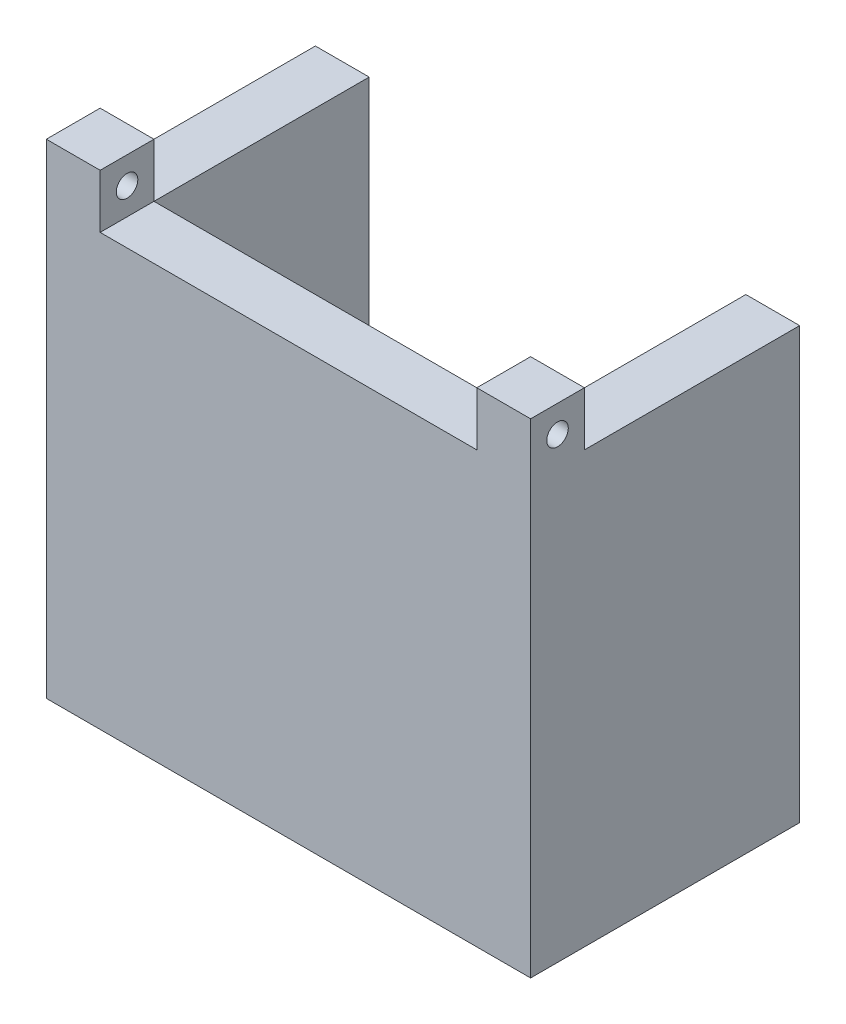
ISO-10303-21;
HEADER;
FILE_DESCRIPTION(('STEP AP214'),'2;1');
FILE_NAME('part.step','',(''),(''),'','','');
FILE_SCHEMA(('AUTOMOTIVE_DESIGN { 1 0 10303 214 1 1 1 1 }'));
ENDSEC;
DATA;
#1=APPLICATION_CONTEXT('core data for automotive mechanical design processes');
#2=APPLICATION_PROTOCOL_DEFINITION('international standard','automotive_design',2000,#1);
#3=PRODUCT_CONTEXT('',#1,'mechanical');
#4=PRODUCT('Part','Part','',(#3));
#5=PRODUCT_RELATED_PRODUCT_CATEGORY('part','',(#4));
#6=PRODUCT_DEFINITION_FORMATION('','',#4);
#7=PRODUCT_DEFINITION_CONTEXT('part definition',#1,'design');
#8=PRODUCT_DEFINITION('design','',#6,#7);
#9=PRODUCT_DEFINITION_SHAPE('','',#8);
#10=(LENGTH_UNIT() NAMED_UNIT(*) SI_UNIT(.MILLI.,.METRE.));
#11=(NAMED_UNIT(*) PLANE_ANGLE_UNIT() SI_UNIT($,.RADIAN.));
#12=(NAMED_UNIT(*) SI_UNIT($,.STERADIAN.) SOLID_ANGLE_UNIT());
#13=UNCERTAINTY_MEASURE_WITH_UNIT(LENGTH_MEASURE(1.E-05),#10,'distance_accuracy_value','');
#14=(GEOMETRIC_REPRESENTATION_CONTEXT(3) GLOBAL_UNCERTAINTY_ASSIGNED_CONTEXT((#13)) GLOBAL_UNIT_ASSIGNED_CONTEXT((#10,
#11,#12)) REPRESENTATION_CONTEXT('',''));
#15=CARTESIAN_POINT('',(0.,0.,0.));
#16=DIRECTION('',(0.,0.,1.));
#17=DIRECTION('',(1.,0.,0.));
#18=AXIS2_PLACEMENT_3D('',#15,#16,#17);
#19=CARTESIAN_POINT('',(0.,0.,0.));
#20=DIRECTION('',(0.,0.,1.));
#21=DIRECTION('',(1.,0.,0.));
#22=AXIS2_PLACEMENT_3D('',#19,#20,#21);
#23=PLANE('',#22);
#24=DIRECTION('',(0.,1.,0.));
#25=VECTOR('',#24,1.);
#26=CARTESIAN_POINT('',(-17.5,22.5,0.));
#27=LINE('',#26,#25);
#28=CARTESIAN_POINT('',(-17.5,17.5,0.));
#29=VERTEX_POINT('',#28);
#30=CARTESIAN_POINT('',(-17.5,22.5,0.));
#31=VERTEX_POINT('',#30);
#32=EDGE_CURVE('E237',#29,#31,#27,.T.);
#33=ORIENTED_EDGE('',*,*,#32,.F.);
#34=DIRECTION('',(-1.,0.,0.));
#35=VECTOR('',#34,1.);
#36=CARTESIAN_POINT('',(-22.5,17.5,0.));
#37=LINE('',#36,#35);
#38=CARTESIAN_POINT('',(-22.5,17.5,0.));
#39=VERTEX_POINT('',#38);
#40=EDGE_CURVE('E163',#29,#39,#37,.T.);
#41=ORIENTED_EDGE('',*,*,#40,.T.);
#42=DIRECTION('',(0.,-1.,0.));
#43=VECTOR('',#42,1.);
#44=CARTESIAN_POINT('',(-22.5,22.5,0.));
#45=LINE('',#44,#43);
#46=CARTESIAN_POINT('',(-22.5,22.5,0.));
#47=VERTEX_POINT('',#46);
#48=EDGE_CURVE('E139',#47,#39,#45,.T.);
#49=ORIENTED_EDGE('',*,*,#48,.F.);
#50=DIRECTION('',(-1.,0.,0.));
#51=VECTOR('',#50,1.);
#52=CARTESIAN_POINT('',(-22.5,22.5,0.));
#53=LINE('',#52,#51);
#54=EDGE_CURVE('E213',#31,#47,#53,.T.);
#55=ORIENTED_EDGE('',*,*,#54,.F.);
#56=EDGE_LOOP('',(#33,#41,#49,#55));
#57=FACE_BOUND('',#56,.T.);
#58=ADVANCED_FACE('F33',(#57),#23,.F.);
#59=DIRECTION('',(1.,0.,0.));
#60=VECTOR('',#59,1.);
#61=CARTESIAN_POINT('',(22.5,17.5,0.));
#62=LINE('',#61,#60);
#63=CARTESIAN_POINT('',(17.5,17.5,0.));
#64=VERTEX_POINT('',#63);
#65=CARTESIAN_POINT('',(22.5,17.5,0.));
#66=VERTEX_POINT('',#65);
#67=EDGE_CURVE('E172',#64,#66,#62,.T.);
#68=ORIENTED_EDGE('',*,*,#67,.F.);
#69=DIRECTION('',(0.,-1.,0.));
#70=VECTOR('',#69,1.);
#71=CARTESIAN_POINT('',(17.5,22.5,0.));
#72=LINE('',#71,#70);
#73=CARTESIAN_POINT('',(17.5,22.5,0.));
#74=VERTEX_POINT('',#73);
#75=EDGE_CURVE('E259',#74,#64,#72,.T.);
#76=ORIENTED_EDGE('',*,*,#75,.F.);
#77=CARTESIAN_POINT('',(22.5,22.5,0.));
#78=VERTEX_POINT('',#77);
#79=EDGE_CURVE('E221',#78,#74,#53,.T.);
#80=ORIENTED_EDGE('',*,*,#79,.F.);
#81=DIRECTION('',(0.,1.,0.));
#82=VECTOR('',#81,1.);
#83=CARTESIAN_POINT('',(22.5,22.5,0.));
#84=LINE('',#83,#82);
#85=EDGE_CURVE('E211',#66,#78,#84,.T.);
#86=ORIENTED_EDGE('',*,*,#85,.F.);
#87=EDGE_LOOP('',(#68,#76,#80,#86));
#88=FACE_BOUND('',#87,.T.);
#89=ADVANCED_FACE('F310',(#88),#23,.F.);
#90=DIRECTION('',(1.,0.,0.));
#91=VECTOR('',#90,1.);
#92=CARTESIAN_POINT('',(-22.5,-22.5,0.));
#93=LINE('',#92,#91);
#94=CARTESIAN_POINT('',(-17.5,-22.5,0.));
#95=VERTEX_POINT('',#94);
#96=CARTESIAN_POINT('',(17.5,-22.5,0.));
#97=VERTEX_POINT('',#96);
#98=EDGE_CURVE('E37',#95,#97,#93,.T.);
#99=ORIENTED_EDGE('',*,*,#98,.F.);
#100=DIRECTION('',(0.,1.,0.));
#101=VECTOR('',#100,1.);
#102=CARTESIAN_POINT('',(-17.5,-22.5,0.));
#103=LINE('',#102,#101);
#104=EDGE_CURVE('E51',#95,#29,#103,.T.);
#105=ORIENTED_EDGE('',*,*,#104,.T.);
#106=DIRECTION('',(-1.,0.,0.));
#107=VECTOR('',#106,1.);
#108=CARTESIAN_POINT('',(17.5,17.5,0.));
#109=LINE('',#108,#107);
#110=EDGE_CURVE('E242',#64,#29,#109,.T.);
#111=ORIENTED_EDGE('',*,*,#110,.F.);
#112=DIRECTION('',(0.,1.,0.));
#113=VECTOR('',#112,1.);
#114=CARTESIAN_POINT('',(17.5,-22.5,0.));
#115=LINE('',#114,#113);
#116=EDGE_CURVE('E144',#97,#64,#115,.T.);
#117=ORIENTED_EDGE('',*,*,#116,.F.);
#118=EDGE_LOOP('',(#99,#105,#111,#117));
#119=FACE_BOUND('',#118,.T.);
#120=ADVANCED_FACE('F240',(#119),#23,.F.);
#121=CARTESIAN_POINT('',(-22.5,22.5,5.));
#122=DIRECTION('',(0.,-1.,0.));
#123=DIRECTION('',(0.,0.,-1.));
#124=AXIS2_PLACEMENT_3D('',#121,#122,#123);
#125=PLANE('',#124);
#126=ORIENTED_EDGE('',*,*,#79,.T.);
#127=DIRECTION('',(0.,0.,-1.));
#128=VECTOR('',#127,1.);
#129=CARTESIAN_POINT('',(17.5,22.5,5.));
#130=LINE('',#129,#128);
#131=CARTESIAN_POINT('',(17.5,22.5,5.));
#132=VERTEX_POINT('',#131);
#133=EDGE_CURVE('E266',#132,#74,#130,.T.);
#134=ORIENTED_EDGE('',*,*,#133,.F.);
#135=DIRECTION('',(-1.,0.,0.));
#136=VECTOR('',#135,1.);
#137=CARTESIAN_POINT('',(-22.5,22.5,5.));
#138=LINE('',#137,#136);
#139=CARTESIAN_POINT('',(22.5,22.5,5.));
#140=VERTEX_POINT('',#139);
#141=EDGE_CURVE('E279',#140,#132,#138,.T.);
#142=ORIENTED_EDGE('',*,*,#141,.F.);
#143=DIRECTION('',(0.,0.,-1.));
#144=VECTOR('',#143,1.);
#145=CARTESIAN_POINT('',(22.5,22.5,5.));
#146=LINE('',#145,#144);
#147=EDGE_CURVE('E11',#140,#78,#146,.T.);
#148=ORIENTED_EDGE('',*,*,#147,.T.);
#149=EDGE_LOOP('',(#126,#134,#142,#148));
#150=FACE_BOUND('',#149,.T.);
#151=ADVANCED_FACE('F292',(#150),#125,.F.);
#152=CARTESIAN_POINT('',(22.5,22.5,5.));
#153=DIRECTION('',(-1.,0.,0.));
#154=DIRECTION('',(0.,-1.,0.));
#155=AXIS2_PLACEMENT_3D('',#152,#153,#154);
#156=PLANE('',#155);
#157=CARTESIAN_POINT('',(22.5,20.,2.5));
#158=DIRECTION('',(1.,0.,0.));
#159=DIRECTION('',(0.,1.,0.));
#160=AXIS2_PLACEMENT_3D('',#157,#158,#159);
#161=CIRCLE('',#160,1.);
#162=CARTESIAN_POINT('',(22.5,21.,2.5));
#163=VERTEX_POINT('',#162);
#164=EDGE_CURVE('E214',#163,#163,#161,.T.);
#165=ORIENTED_EDGE('',*,*,#164,.F.);
#166=EDGE_LOOP('',(#165));
#167=FACE_BOUND('',#166,.T.);
#168=DIRECTION('',(0.,0.,-1.));
#169=VECTOR('',#168,1.);
#170=CARTESIAN_POINT('',(22.5,-22.5,5.));
#171=LINE('',#170,#169);
#172=CARTESIAN_POINT('',(22.5,-22.5,5.));
#173=VERTEX_POINT('',#172);
#174=CARTESIAN_POINT('',(22.5,-22.5,-20.));
#175=VERTEX_POINT('',#174);
#176=EDGE_CURVE('E226',#173,#175,#171,.T.);
#177=ORIENTED_EDGE('',*,*,#176,.T.);
#178=DIRECTION('',(0.,-1.,0.));
#179=VECTOR('',#178,1.);
#180=CARTESIAN_POINT('',(22.5,-22.5,-20.));
#181=LINE('',#180,#179);
#182=CARTESIAN_POINT('',(22.5,17.5,-20.));
#183=VERTEX_POINT('',#182);
#184=EDGE_CURVE('E168',#183,#175,#181,.T.);
#185=ORIENTED_EDGE('',*,*,#184,.F.);
#186=DIRECTION('',(0.,0.,1.));
#187=VECTOR('',#186,1.);
#188=CARTESIAN_POINT('',(22.5,17.5,-20.));
#189=LINE('',#188,#187);
#190=EDGE_CURVE('E178',#183,#66,#189,.T.);
#191=ORIENTED_EDGE('',*,*,#190,.T.);
#192=ORIENTED_EDGE('',*,*,#85,.T.);
#193=ORIENTED_EDGE('',*,*,#147,.F.);
#194=DIRECTION('',(0.,1.,0.));
#195=VECTOR('',#194,1.);
#196=CARTESIAN_POINT('',(22.5,22.5,5.));
#197=LINE('',#196,#195);
#198=EDGE_CURVE('E275',#173,#140,#197,.T.);
#199=ORIENTED_EDGE('',*,*,#198,.F.);
#200=EDGE_LOOP('',(#177,#185,#191,#192,#193,#199));
#201=FACE_BOUND('',#200,.T.);
#202=ADVANCED_FACE('F35',(#167,#201),#156,.F.);
#203=CARTESIAN_POINT('',(-17.5,22.5,5.));
#204=VERTEX_POINT('',#203);
#205=CARTESIAN_POINT('',(-22.5,22.5,5.));
#206=VERTEX_POINT('',#205);
#207=EDGE_CURVE('E278',#204,#206,#138,.T.);
#208=ORIENTED_EDGE('',*,*,#207,.F.);
#209=DIRECTION('',(0.,0.,-1.));
#210=VECTOR('',#209,1.);
#211=CARTESIAN_POINT('',(-17.5,22.5,5.));
#212=LINE('',#211,#210);
#213=EDGE_CURVE('E254',#204,#31,#212,.T.);
#214=ORIENTED_EDGE('',*,*,#213,.T.);
#215=ORIENTED_EDGE('',*,*,#54,.T.);
#216=DIRECTION('',(0.,0.,-1.));
#217=VECTOR('',#216,1.);
#218=CARTESIAN_POINT('',(-22.5,22.5,5.));
#219=LINE('',#218,#217);
#220=EDGE_CURVE('E43',#206,#47,#219,.T.);
#221=ORIENTED_EDGE('',*,*,#220,.F.);
#222=EDGE_LOOP('',(#208,#214,#215,#221));
#223=FACE_BOUND('',#222,.T.);
#224=ADVANCED_FACE('F298',(#223),#125,.F.);
#225=CARTESIAN_POINT('',(-22.5,22.5,5.));
#226=DIRECTION('',(1.,0.,0.));
#227=DIRECTION('',(0.,1.,0.));
#228=AXIS2_PLACEMENT_3D('',#225,#226,#227);
#229=PLANE('',#228);
#230=CARTESIAN_POINT('',(-22.5,20.,2.5));
#231=DIRECTION('',(1.,0.,0.));
#232=DIRECTION('',(0.,1.,0.));
#233=AXIS2_PLACEMENT_3D('',#230,#231,#232);
#234=CIRCLE('',#233,1.);
#235=CARTESIAN_POINT('',(-22.5,21.,2.5));
#236=VERTEX_POINT('',#235);
#237=EDGE_CURVE('E200',#236,#236,#234,.T.);
#238=ORIENTED_EDGE('',*,*,#237,.T.);
#239=EDGE_LOOP('',(#238));
#240=FACE_BOUND('',#239,.T.);
#241=ORIENTED_EDGE('',*,*,#48,.T.);
#242=DIRECTION('',(0.,0.,1.));
#243=VECTOR('',#242,1.);
#244=CARTESIAN_POINT('',(-22.5,17.5,-20.));
#245=LINE('',#244,#243);
#246=CARTESIAN_POINT('',(-22.5,17.5,-20.));
#247=VERTEX_POINT('',#246);
#248=EDGE_CURVE('E131',#247,#39,#245,.T.);
#249=ORIENTED_EDGE('',*,*,#248,.F.);
#250=DIRECTION('',(0.,-1.,0.));
#251=VECTOR('',#250,1.);
#252=CARTESIAN_POINT('',(-22.5,-22.5,-20.));
#253=LINE('',#252,#251);
#254=CARTESIAN_POINT('',(-22.5,-22.5,-20.));
#255=VERTEX_POINT('',#254);
#256=EDGE_CURVE('E135',#247,#255,#253,.T.);
#257=ORIENTED_EDGE('',*,*,#256,.T.);
#258=DIRECTION('',(0.,0.,-1.));
#259=VECTOR('',#258,1.);
#260=CARTESIAN_POINT('',(-22.5,-22.5,5.));
#261=LINE('',#260,#259);
#262=CARTESIAN_POINT('',(-22.5,-22.5,5.));
#263=VERTEX_POINT('',#262);
#264=EDGE_CURVE('E228',#263,#255,#261,.T.);
#265=ORIENTED_EDGE('',*,*,#264,.F.);
#266=DIRECTION('',(0.,-1.,0.));
#267=VECTOR('',#266,1.);
#268=CARTESIAN_POINT('',(-22.5,22.5,5.));
#269=LINE('',#268,#267);
#270=EDGE_CURVE('E231',#206,#263,#269,.T.);
#271=ORIENTED_EDGE('',*,*,#270,.F.);
#272=ORIENTED_EDGE('',*,*,#220,.T.);
#273=EDGE_LOOP('',(#241,#249,#257,#265,#271,#272));
#274=FACE_BOUND('',#273,.T.);
#275=ADVANCED_FACE('F133',(#240,#274),#229,.F.);
#276=CARTESIAN_POINT('',(-22.5,-22.5,5.));
#277=DIRECTION('',(0.,1.,0.));
#278=DIRECTION('',(0.,0.,1.));
#279=AXIS2_PLACEMENT_3D('',#276,#277,#278);
#280=PLANE('',#279);
#281=ORIENTED_EDGE('',*,*,#264,.T.);
#282=DIRECTION('',(1.,0.,0.));
#283=VECTOR('',#282,1.);
#284=CARTESIAN_POINT('',(-22.5,-22.5,-20.));
#285=LINE('',#284,#283);
#286=CARTESIAN_POINT('',(-17.5,-22.5,-20.));
#287=VERTEX_POINT('',#286);
#288=EDGE_CURVE('E154',#255,#287,#285,.T.);
#289=ORIENTED_EDGE('',*,*,#288,.T.);
#290=DIRECTION('',(0.,0.,1.));
#291=VECTOR('',#290,1.);
#292=CARTESIAN_POINT('',(-17.5,-22.5,-20.));
#293=LINE('',#292,#291);
#294=EDGE_CURVE('E162',#287,#95,#293,.T.);
#295=ORIENTED_EDGE('',*,*,#294,.T.);
#296=ORIENTED_EDGE('',*,*,#98,.T.);
#297=DIRECTION('',(0.,0.,1.));
#298=VECTOR('',#297,1.);
#299=CARTESIAN_POINT('',(17.5,-22.5,-20.));
#300=LINE('',#299,#298);
#301=CARTESIAN_POINT('',(17.5,-22.5,-20.));
#302=VERTEX_POINT('',#301);
#303=EDGE_CURVE('E195',#302,#97,#300,.T.);
#304=ORIENTED_EDGE('',*,*,#303,.F.);
#305=DIRECTION('',(-1.,0.,0.));
#306=VECTOR('',#305,1.);
#307=CARTESIAN_POINT('',(22.5,-22.5,-20.));
#308=LINE('',#307,#306);
#309=EDGE_CURVE('E171',#175,#302,#308,.T.);
#310=ORIENTED_EDGE('',*,*,#309,.F.);
#311=ORIENTED_EDGE('',*,*,#176,.F.);
#312=DIRECTION('',(1.,0.,0.));
#313=VECTOR('',#312,1.);
#314=CARTESIAN_POINT('',(-22.5,-22.5,5.));
#315=LINE('',#314,#313);
#316=EDGE_CURVE('E219',#263,#173,#315,.T.);
#317=ORIENTED_EDGE('',*,*,#316,.F.);
#318=EDGE_LOOP('',(#281,#289,#295,#296,#304,#310,#311,#317));
#319=FACE_BOUND('',#318,.T.);
#320=ADVANCED_FACE('F289',(#319),#280,.F.);
#321=CARTESIAN_POINT('',(0.,0.,5.));
#322=DIRECTION('',(0.,0.,1.));
#323=DIRECTION('',(1.,0.,0.));
#324=AXIS2_PLACEMENT_3D('',#321,#322,#323);
#325=PLANE('',#324);
#326=DIRECTION('',(0.,-1.,0.));
#327=VECTOR('',#326,1.);
#328=CARTESIAN_POINT('',(17.5,22.5,5.));
#329=LINE('',#328,#327);
#330=CARTESIAN_POINT('',(17.5,17.5,5.));
#331=VERTEX_POINT('',#330);
#332=EDGE_CURVE('E261',#132,#331,#329,.T.);
#333=ORIENTED_EDGE('',*,*,#332,.T.);
#334=DIRECTION('',(-1.,0.,0.));
#335=VECTOR('',#334,1.);
#336=CARTESIAN_POINT('',(17.5,17.5,5.));
#337=LINE('',#336,#335);
#338=CARTESIAN_POINT('',(-17.5,17.5,5.));
#339=VERTEX_POINT('',#338);
#340=EDGE_CURVE('E294',#331,#339,#337,.T.);
#341=ORIENTED_EDGE('',*,*,#340,.T.);
#342=DIRECTION('',(0.,1.,0.));
#343=VECTOR('',#342,1.);
#344=CARTESIAN_POINT('',(-17.5,22.5,5.));
#345=LINE('',#344,#343);
#346=EDGE_CURVE('E250',#339,#204,#345,.T.);
#347=ORIENTED_EDGE('',*,*,#346,.T.);
#348=ORIENTED_EDGE('',*,*,#207,.T.);
#349=ORIENTED_EDGE('',*,*,#270,.T.);
#350=ORIENTED_EDGE('',*,*,#316,.T.);
#351=ORIENTED_EDGE('',*,*,#198,.T.);
#352=ORIENTED_EDGE('',*,*,#141,.T.);
#353=EDGE_LOOP('',(#333,#341,#347,#348,#349,#350,#351,#352));
#354=FACE_BOUND('',#353,.T.);
#355=ADVANCED_FACE('F285',(#354),#325,.T.);
#356=CARTESIAN_POINT('',(17.5,20.,2.5));
#357=DIRECTION('',(1.,0.,0.));
#358=DIRECTION('',(0.,1.,0.));
#359=AXIS2_PLACEMENT_3D('',#356,#357,#358);
#360=CYLINDRICAL_SURFACE('',#359,1.);
#361=CARTESIAN_POINT('',(17.5,20.,2.5));
#362=DIRECTION('',(1.,0.,0.));
#363=DIRECTION('',(0.,1.,0.));
#364=AXIS2_PLACEMENT_3D('',#361,#362,#363);
#365=CIRCLE('',#364,1.);
#366=CARTESIAN_POINT('',(17.5,21.,2.5));
#367=VERTEX_POINT('',#366);
#368=EDGE_CURVE('E268',#367,#367,#365,.F.);
#369=ORIENTED_EDGE('',*,*,#368,.T.);
#370=EDGE_LOOP('',(#369));
#371=FACE_BOUND('',#370,.T.);
#372=ORIENTED_EDGE('',*,*,#164,.T.);
#373=EDGE_LOOP('',(#372));
#374=FACE_BOUND('',#373,.T.);
#375=ADVANCED_FACE('F399',(#371,#374),#360,.F.);
#376=CARTESIAN_POINT('',(17.5,22.5,5.));
#377=DIRECTION('',(1.,0.,0.));
#378=DIRECTION('',(0.,1.,0.));
#379=AXIS2_PLACEMENT_3D('',#376,#377,#378);
#380=PLANE('',#379);
#381=ORIENTED_EDGE('',*,*,#75,.T.);
#382=DIRECTION('',(0.,0.,-1.));
#383=VECTOR('',#382,1.);
#384=CARTESIAN_POINT('',(17.5,17.5,5.));
#385=LINE('',#384,#383);
#386=EDGE_CURVE('E255',#331,#64,#385,.T.);
#387=ORIENTED_EDGE('',*,*,#386,.F.);
#388=ORIENTED_EDGE('',*,*,#332,.F.);
#389=ORIENTED_EDGE('',*,*,#133,.T.);
#390=EDGE_LOOP('',(#381,#387,#388,#389));
#391=FACE_BOUND('',#390,.T.);
#392=ORIENTED_EDGE('',*,*,#368,.F.);
#393=EDGE_LOOP('',(#392));
#394=FACE_BOUND('',#393,.T.);
#395=ADVANCED_FACE('F349',(#391,#394),#380,.F.);
#396=CARTESIAN_POINT('',(-17.5,22.5,5.));
#397=DIRECTION('',(-1.,0.,0.));
#398=DIRECTION('',(0.,-1.,0.));
#399=AXIS2_PLACEMENT_3D('',#396,#397,#398);
#400=PLANE('',#399);
#401=CARTESIAN_POINT('',(-17.5,20.,2.5));
#402=DIRECTION('',(1.,0.,0.));
#403=DIRECTION('',(0.,1.,0.));
#404=AXIS2_PLACEMENT_3D('',#401,#402,#403);
#405=CIRCLE('',#404,1.);
#406=CARTESIAN_POINT('',(-17.5,21.,2.5));
#407=VERTEX_POINT('',#406);
#408=EDGE_CURVE('E205',#407,#407,#405,.T.);
#409=ORIENTED_EDGE('',*,*,#408,.F.);
#410=EDGE_LOOP('',(#409));
#411=FACE_BOUND('',#410,.T.);
#412=ORIENTED_EDGE('',*,*,#32,.T.);
#413=ORIENTED_EDGE('',*,*,#213,.F.);
#414=ORIENTED_EDGE('',*,*,#346,.F.);
#415=DIRECTION('',(0.,0.,-1.));
#416=VECTOR('',#415,1.);
#417=CARTESIAN_POINT('',(-17.5,17.5,5.));
#418=LINE('',#417,#416);
#419=EDGE_CURVE('E246',#339,#29,#418,.T.);
#420=ORIENTED_EDGE('',*,*,#419,.T.);
#421=EDGE_LOOP('',(#412,#413,#414,#420));
#422=FACE_BOUND('',#421,.T.);
#423=ADVANCED_FACE('F247',(#411,#422),#400,.F.);
#424=CARTESIAN_POINT('',(17.5,17.5,5.));
#425=DIRECTION('',(0.,-1.,0.));
#426=DIRECTION('',(0.,0.,-1.));
#427=AXIS2_PLACEMENT_3D('',#424,#425,#426);
#428=PLANE('',#427);
#429=ORIENTED_EDGE('',*,*,#110,.T.);
#430=ORIENTED_EDGE('',*,*,#419,.F.);
#431=ORIENTED_EDGE('',*,*,#340,.F.);
#432=ORIENTED_EDGE('',*,*,#386,.T.);
#433=EDGE_LOOP('',(#429,#430,#431,#432));
#434=FACE_BOUND('',#433,.T.);
#435=ADVANCED_FACE('F257',(#434),#428,.F.);
#436=CARTESIAN_POINT('',(-17.5,20.,2.5));
#437=DIRECTION('',(-1.,0.,0.));
#438=DIRECTION('',(0.,-1.,0.));
#439=AXIS2_PLACEMENT_3D('',#436,#437,#438);
#440=CYLINDRICAL_SURFACE('',#439,1.);
#441=ORIENTED_EDGE('',*,*,#408,.T.);
#442=EDGE_LOOP('',(#441));
#443=FACE_BOUND('',#442,.T.);
#444=ORIENTED_EDGE('',*,*,#237,.F.);
#445=EDGE_LOOP('',(#444));
#446=FACE_BOUND('',#445,.T.);
#447=ADVANCED_FACE('F358',(#443,#446),#440,.F.);
#448=CARTESIAN_POINT('',(17.5,-22.5,-20.));
#449=DIRECTION('',(1.,0.,0.));
#450=DIRECTION('',(0.,0.,-1.));
#451=AXIS2_PLACEMENT_3D('',#448,#449,#450);
#452=PLANE('',#451);
#453=ORIENTED_EDGE('',*,*,#116,.T.);
#454=DIRECTION('',(0.,0.,1.));
#455=VECTOR('',#454,1.);
#456=CARTESIAN_POINT('',(17.5,17.5,-20.));
#457=LINE('',#456,#455);
#458=CARTESIAN_POINT('',(17.5,17.5,-20.));
#459=VERTEX_POINT('',#458);
#460=EDGE_CURVE('E181',#459,#64,#457,.T.);
#461=ORIENTED_EDGE('',*,*,#460,.F.);
#462=DIRECTION('',(0.,1.,0.));
#463=VECTOR('',#462,1.);
#464=CARTESIAN_POINT('',(17.5,-22.5,-20.));
#465=LINE('',#464,#463);
#466=EDGE_CURVE('E174',#302,#459,#465,.T.);
#467=ORIENTED_EDGE('',*,*,#466,.F.);
#468=ORIENTED_EDGE('',*,*,#303,.T.);
#469=EDGE_LOOP('',(#453,#461,#467,#468));
#470=FACE_BOUND('',#469,.T.);
#471=ADVANCED_FACE('F394',(#470),#452,.F.);
#472=CARTESIAN_POINT('',(22.5,17.5,-20.));
#473=DIRECTION('',(0.,-1.,0.));
#474=DIRECTION('',(0.,0.,-1.));
#475=AXIS2_PLACEMENT_3D('',#472,#473,#474);
#476=PLANE('',#475);
#477=ORIENTED_EDGE('',*,*,#67,.T.);
#478=ORIENTED_EDGE('',*,*,#190,.F.);
#479=DIRECTION('',(1.,0.,0.));
#480=VECTOR('',#479,1.);
#481=CARTESIAN_POINT('',(22.5,17.5,-20.));
#482=LINE('',#481,#480);
#483=EDGE_CURVE('E176',#459,#183,#482,.T.);
#484=ORIENTED_EDGE('',*,*,#483,.F.);
#485=ORIENTED_EDGE('',*,*,#460,.T.);
#486=EDGE_LOOP('',(#477,#478,#484,#485));
#487=FACE_BOUND('',#486,.T.);
#488=ADVANCED_FACE('F390',(#487),#476,.F.);
#489=CARTESIAN_POINT('',(0.,0.,-20.));
#490=DIRECTION('',(0.,0.,1.));
#491=DIRECTION('',(1.,0.,0.));
#492=AXIS2_PLACEMENT_3D('',#489,#490,#491);
#493=PLANE('',#492);
#494=ORIENTED_EDGE('',*,*,#184,.T.);
#495=ORIENTED_EDGE('',*,*,#309,.T.);
#496=ORIENTED_EDGE('',*,*,#466,.T.);
#497=ORIENTED_EDGE('',*,*,#483,.T.);
#498=EDGE_LOOP('',(#494,#495,#496,#497));
#499=FACE_BOUND('',#498,.T.);
#500=ADVANCED_FACE('F367',(#499),#493,.F.);
#501=CARTESIAN_POINT('',(-22.5,17.5,-20.));
#502=DIRECTION('',(0.,1.,0.));
#503=DIRECTION('',(0.,0.,1.));
#504=AXIS2_PLACEMENT_3D('',#501,#502,#503);
#505=PLANE('',#504);
#506=ORIENTED_EDGE('',*,*,#40,.F.);
#507=DIRECTION('',(0.,0.,1.));
#508=VECTOR('',#507,1.);
#509=CARTESIAN_POINT('',(-17.5,17.5,-20.));
#510=LINE('',#509,#508);
#511=CARTESIAN_POINT('',(-17.5,17.5,-20.));
#512=VERTEX_POINT('',#511);
#513=EDGE_CURVE('E145',#512,#29,#510,.T.);
#514=ORIENTED_EDGE('',*,*,#513,.F.);
#515=DIRECTION('',(-1.,0.,0.));
#516=VECTOR('',#515,1.);
#517=CARTESIAN_POINT('',(-22.5,17.5,-20.));
#518=LINE('',#517,#516);
#519=EDGE_CURVE('E151',#512,#247,#518,.T.);
#520=ORIENTED_EDGE('',*,*,#519,.T.);
#521=ORIENTED_EDGE('',*,*,#248,.T.);
#522=EDGE_LOOP('',(#506,#514,#520,#521));
#523=FACE_BOUND('',#522,.T.);
#524=ADVANCED_FACE('F156',(#523),#505,.T.);
#525=CARTESIAN_POINT('',(-17.5,-22.5,-20.));
#526=DIRECTION('',(1.,0.,0.));
#527=DIRECTION('',(0.,0.,-1.));
#528=AXIS2_PLACEMENT_3D('',#525,#526,#527);
#529=PLANE('',#528);
#530=ORIENTED_EDGE('',*,*,#104,.F.);
#531=ORIENTED_EDGE('',*,*,#294,.F.);
#532=DIRECTION('',(0.,1.,0.));
#533=VECTOR('',#532,1.);
#534=CARTESIAN_POINT('',(-17.5,-22.5,-20.));
#535=LINE('',#534,#533);
#536=EDGE_CURVE('E157',#287,#512,#535,.T.);
#537=ORIENTED_EDGE('',*,*,#536,.T.);
#538=ORIENTED_EDGE('',*,*,#513,.T.);
#539=EDGE_LOOP('',(#530,#531,#537,#538));
#540=FACE_BOUND('',#539,.T.);
#541=ADVANCED_FACE('F366',(#540),#529,.T.);
#542=CARTESIAN_POINT('',(0.,0.,-20.));
#543=DIRECTION('',(0.,0.,1.));
#544=DIRECTION('',(-1.,0.,0.));
#545=AXIS2_PLACEMENT_3D('',#542,#543,#544);
#546=PLANE('',#545);
#547=ORIENTED_EDGE('',*,*,#256,.F.);
#548=ORIENTED_EDGE('',*,*,#519,.F.);
#549=ORIENTED_EDGE('',*,*,#536,.F.);
#550=ORIENTED_EDGE('',*,*,#288,.F.);
#551=EDGE_LOOP('',(#547,#548,#549,#550));
#552=FACE_BOUND('',#551,.T.);
#553=ADVANCED_FACE('F149',(#552),#546,.F.);
#554=CLOSED_SHELL('',(#58,#89,#120,#151,#202,#224,#275,#320,#355,#375,#395,#423,#435,#447,#471,
#488,#500,#524,#541,#553));
#555=MANIFOLD_SOLID_BREP('B2',#554);
#556=ADVANCED_BREP_SHAPE_REPRESENTATION('',(#18,#555),#14);
#557=SHAPE_DEFINITION_REPRESENTATION(#9,#556);
ENDSEC;
END-ISO-10303-21;
